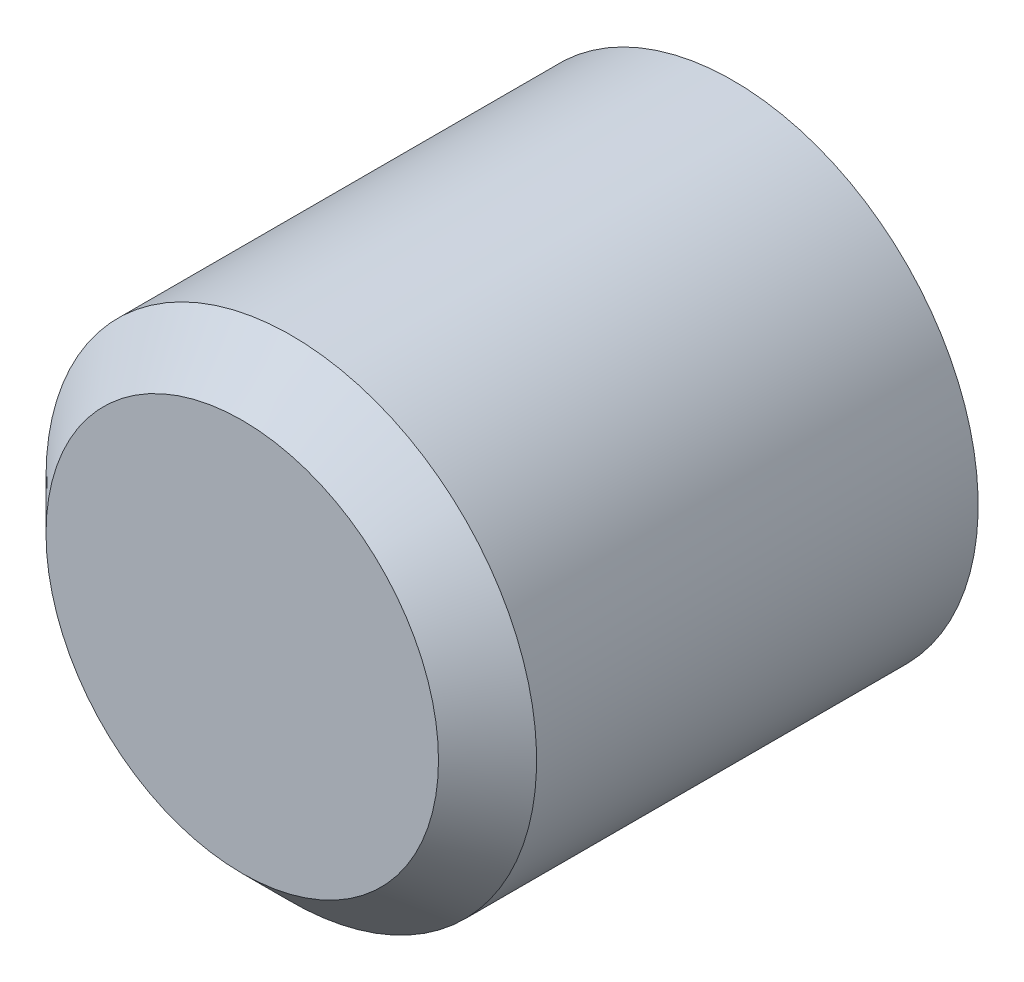
ISO-10303-21;
HEADER;
FILE_DESCRIPTION(('STEP AP214'),'2;1');
FILE_NAME('part.step','',(''),(''),'','','');
FILE_SCHEMA(('AUTOMOTIVE_DESIGN { 1 0 10303 214 1 1 1 1 }'));
ENDSEC;
DATA;
#1=APPLICATION_CONTEXT('core data for automotive mechanical design processes');
#2=APPLICATION_PROTOCOL_DEFINITION('international standard','automotive_design',2000,#1);
#3=PRODUCT_CONTEXT('',#1,'mechanical');
#4=PRODUCT('Part','Part','',(#3));
#5=PRODUCT_RELATED_PRODUCT_CATEGORY('part','',(#4));
#6=PRODUCT_DEFINITION_FORMATION('','',#4);
#7=PRODUCT_DEFINITION_CONTEXT('part definition',#1,'design');
#8=PRODUCT_DEFINITION('design','',#6,#7);
#9=PRODUCT_DEFINITION_SHAPE('','',#8);
#10=(LENGTH_UNIT() NAMED_UNIT(*) SI_UNIT(.MILLI.,.METRE.));
#11=(NAMED_UNIT(*) PLANE_ANGLE_UNIT() SI_UNIT($,.RADIAN.));
#12=(NAMED_UNIT(*) SI_UNIT($,.STERADIAN.) SOLID_ANGLE_UNIT());
#13=UNCERTAINTY_MEASURE_WITH_UNIT(LENGTH_MEASURE(1.E-05),#10,'distance_accuracy_value','');
#14=(GEOMETRIC_REPRESENTATION_CONTEXT(3) GLOBAL_UNCERTAINTY_ASSIGNED_CONTEXT((#13)) GLOBAL_UNIT_ASSIGNED_CONTEXT((#10,
#11,#12)) REPRESENTATION_CONTEXT('',''));
#15=CARTESIAN_POINT('',(0.,0.,0.));
#16=DIRECTION('',(0.,0.,1.));
#17=DIRECTION('',(1.,0.,0.));
#18=AXIS2_PLACEMENT_3D('',#15,#16,#17);
#19=CARTESIAN_POINT('',(0.,0.,0.));
#20=DIRECTION('',(0.,0.,-1.));
#21=DIRECTION('',(-1.,0.,0.));
#22=AXIS2_PLACEMENT_3D('',#19,#20,#21);
#23=PLANE('',#22);
#24=CARTESIAN_POINT('',(0.,0.,0.));
#25=DIRECTION('',(0.,0.,-1.));
#26=DIRECTION('',(-1.,0.,0.));
#27=AXIS2_PLACEMENT_3D('',#24,#25,#26);
#28=CIRCLE('',#27,10.);
#29=CARTESIAN_POINT('',(-10.,0.,0.));
#30=VERTEX_POINT('',#29);
#31=EDGE_CURVE('E10',#30,#30,#28,.T.);
#32=ORIENTED_EDGE('',*,*,#31,.T.);
#33=EDGE_LOOP('',(#32));
#34=FACE_BOUND('',#33,.T.);
#35=ADVANCED_FACE('F41',(#34),#23,.T.);
#36=CARTESIAN_POINT('',(0.,0.,-5.));
#37=DIRECTION('',(0.,0.,-1.));
#38=DIRECTION('',(-1.,0.,0.));
#39=AXIS2_PLACEMENT_3D('',#36,#37,#38);
#40=CYLINDRICAL_SURFACE('',#39,10.);
#41=CARTESIAN_POINT('',(0.,0.,18.));
#42=DIRECTION('',(0.,0.,-1.));
#43=DIRECTION('',(-1.,0.,0.));
#44=AXIS2_PLACEMENT_3D('',#41,#42,#43);
#45=CIRCLE('',#44,10.);
#46=CARTESIAN_POINT('',(-10.,0.,18.));
#47=VERTEX_POINT('',#46);
#48=EDGE_CURVE('E47',#47,#47,#45,.T.);
#49=ORIENTED_EDGE('',*,*,#48,.T.);
#50=EDGE_LOOP('',(#49));
#51=FACE_BOUND('',#50,.T.);
#52=ORIENTED_EDGE('',*,*,#31,.F.);
#53=EDGE_LOOP('',(#52));
#54=FACE_BOUND('',#53,.T.);
#55=ADVANCED_FACE('F67',(#51,#54),#40,.T.);
#56=CARTESIAN_POINT('',(0.,0.,18.));
#57=DIRECTION('',(0.,0.,-1.));
#58=DIRECTION('',(-1.,0.,0.));
#59=AXIS2_PLACEMENT_3D('',#56,#57,#58);
#60=CONICAL_SURFACE('',#59,10.,0.785398163397448);
#61=CARTESIAN_POINT('',(0.,0.,20.));
#62=DIRECTION('',(0.,0.,-1.));
#63=DIRECTION('',(-1.,0.,0.));
#64=AXIS2_PLACEMENT_3D('',#61,#62,#63);
#65=CIRCLE('',#64,8.);
#66=CARTESIAN_POINT('',(-8.,0.,20.));
#67=VERTEX_POINT('',#66);
#68=EDGE_CURVE('E51',#67,#67,#65,.T.);
#69=ORIENTED_EDGE('',*,*,#68,.T.);
#70=EDGE_LOOP('',(#69));
#71=FACE_BOUND('',#70,.T.);
#72=ORIENTED_EDGE('',*,*,#48,.F.);
#73=EDGE_LOOP('',(#72));
#74=FACE_BOUND('',#73,.T.);
#75=ADVANCED_FACE('F58',(#71,#74),#60,.T.);
#76=CARTESIAN_POINT('',(8.,0.,20.));
#77=DIRECTION('',(0.,0.,1.));
#78=DIRECTION('',(1.,0.,0.));
#79=AXIS2_PLACEMENT_3D('',#76,#77,#78);
#80=PLANE('',#79);
#81=ORIENTED_EDGE('',*,*,#68,.F.);
#82=EDGE_LOOP('',(#81));
#83=FACE_BOUND('',#82,.T.);
#84=ADVANCED_FACE('F61',(#83),#80,.T.);
#85=CLOSED_SHELL('',(#35,#55,#75,#84));
#86=MANIFOLD_SOLID_BREP('B2',#85);
#87=ADVANCED_BREP_SHAPE_REPRESENTATION('',(#18,#86),#14);
#88=SHAPE_DEFINITION_REPRESENTATION(#9,#87);
ENDSEC;
END-ISO-10303-21;
